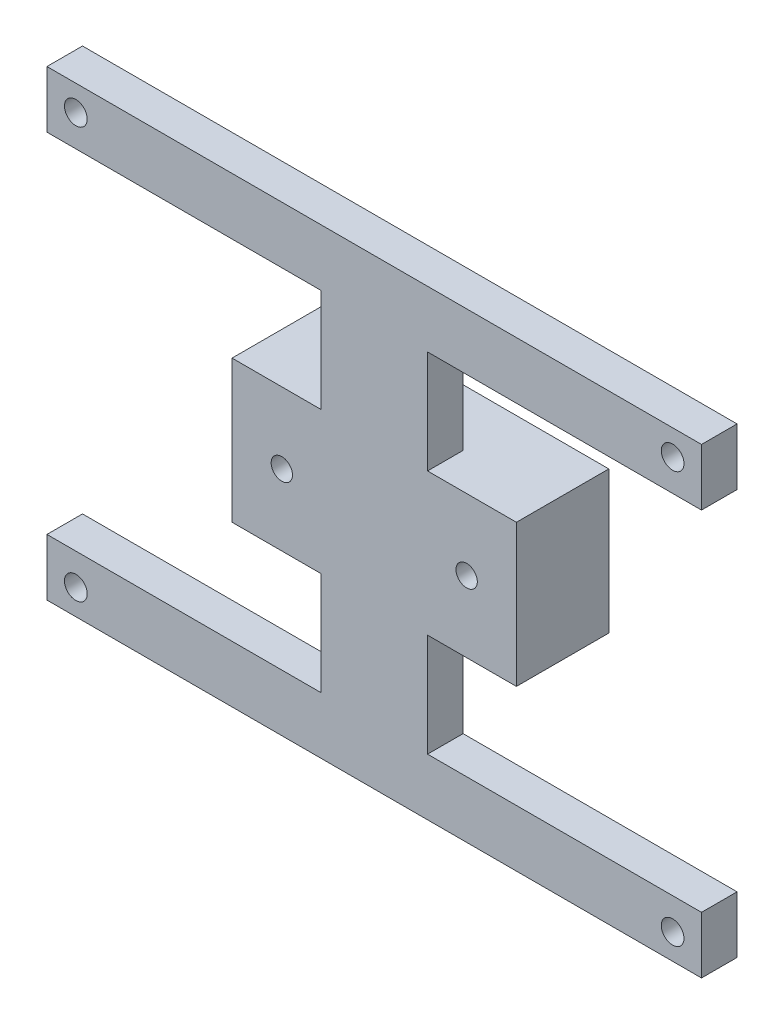
ISO-10303-21;
HEADER;
FILE_DESCRIPTION(('STEP AP214'),'2;1');
FILE_NAME('part.step','',(''),(''),'','','');
FILE_SCHEMA(('AUTOMOTIVE_DESIGN { 1 0 10303 214 1 1 1 1 }'));
ENDSEC;
DATA;
#1=APPLICATION_CONTEXT('core data for automotive mechanical design processes');
#2=APPLICATION_PROTOCOL_DEFINITION('international standard','automotive_design',2000,#1);
#3=PRODUCT_CONTEXT('',#1,'mechanical');
#4=PRODUCT('Part','Part','',(#3));
#5=PRODUCT_RELATED_PRODUCT_CATEGORY('part','',(#4));
#6=PRODUCT_DEFINITION_FORMATION('','',#4);
#7=PRODUCT_DEFINITION_CONTEXT('part definition',#1,'design');
#8=PRODUCT_DEFINITION('design','',#6,#7);
#9=PRODUCT_DEFINITION_SHAPE('','',#8);
#10=(LENGTH_UNIT() NAMED_UNIT(*) SI_UNIT(.MILLI.,.METRE.));
#11=(NAMED_UNIT(*) PLANE_ANGLE_UNIT() SI_UNIT($,.RADIAN.));
#12=(NAMED_UNIT(*) SI_UNIT($,.STERADIAN.) SOLID_ANGLE_UNIT());
#13=UNCERTAINTY_MEASURE_WITH_UNIT(LENGTH_MEASURE(1.E-05),#10,'distance_accuracy_value','');
#14=(GEOMETRIC_REPRESENTATION_CONTEXT(3) GLOBAL_UNCERTAINTY_ASSIGNED_CONTEXT((#13)) GLOBAL_UNIT_ASSIGNED_CONTEXT((#10,
#11,#12)) REPRESENTATION_CONTEXT('',''));
#15=CARTESIAN_POINT('',(0.,0.,0.));
#16=DIRECTION('',(0.,0.,1.));
#17=DIRECTION('',(1.,0.,0.));
#18=AXIS2_PLACEMENT_3D('',#15,#16,#17);
#19=CARTESIAN_POINT('',(0.,0.,0.));
#20=DIRECTION('',(0.,0.,1.));
#21=DIRECTION('',(1.,0.,0.));
#22=AXIS2_PLACEMENT_3D('',#19,#20,#21);
#23=PLANE('',#22);
#24=CARTESIAN_POINT('',(-41.9735,28.92,0.));
#25=DIRECTION('',(0.,0.,1.));
#26=DIRECTION('',(1.,0.,0.));
#27=AXIS2_PLACEMENT_3D('',#24,#25,#26);
#28=CIRCLE('',#27,1.6);
#29=CARTESIAN_POINT('',(-40.3735,28.92,0.));
#30=VERTEX_POINT('',#29);
#31=EDGE_CURVE('E206',#30,#30,#28,.T.);
#32=ORIENTED_EDGE('',*,*,#31,.T.);
#33=EDGE_LOOP('',(#32));
#34=FACE_BOUND('',#33,.T.);
#35=CARTESIAN_POINT('',(41.9735,28.92,0.));
#36=DIRECTION('',(0.,0.,1.));
#37=DIRECTION('',(1.,0.,0.));
#38=AXIS2_PLACEMENT_3D('',#35,#36,#37);
#39=CIRCLE('',#38,1.6);
#40=CARTESIAN_POINT('',(43.5735,28.92,0.));
#41=VERTEX_POINT('',#40);
#42=EDGE_CURVE('E203',#41,#41,#39,.T.);
#43=ORIENTED_EDGE('',*,*,#42,.T.);
#44=EDGE_LOOP('',(#43));
#45=FACE_BOUND('',#44,.T.);
#46=DIRECTION('',(1.,0.,0.));
#47=VECTOR('',#46,1.);
#48=CARTESIAN_POINT('',(20.,10.,0.));
#49=LINE('',#48,#47);
#50=CARTESIAN_POINT('',(-7.5,10.,0.));
#51=VERTEX_POINT('',#50);
#52=CARTESIAN_POINT('',(7.5,10.,0.));
#53=VERTEX_POINT('',#52);
#54=EDGE_CURVE('E11',#51,#53,#49,.T.);
#55=ORIENTED_EDGE('',*,*,#54,.F.);
#56=DIRECTION('',(0.,1.,0.));
#57=VECTOR('',#56,1.);
#58=CARTESIAN_POINT('',(-7.5,0.,0.));
#59=LINE('',#58,#57);
#60=CARTESIAN_POINT('',(-7.5,24.5,0.));
#61=VERTEX_POINT('',#60);
#62=EDGE_CURVE('E221',#51,#61,#59,.T.);
#63=ORIENTED_EDGE('',*,*,#62,.T.);
#64=DIRECTION('',(1.,0.,0.));
#65=VECTOR('',#64,1.);
#66=CARTESIAN_POINT('',(0.,24.5,0.));
#67=LINE('',#66,#65);
#68=CARTESIAN_POINT('',(-46.0375,24.5,0.));
#69=VERTEX_POINT('',#68);
#70=EDGE_CURVE('E218',#69,#61,#67,.T.);
#71=ORIENTED_EDGE('',*,*,#70,.F.);
#72=DIRECTION('',(0.,-1.,0.));
#73=VECTOR('',#72,1.);
#74=CARTESIAN_POINT('',(-46.0375,0.,0.));
#75=LINE('',#74,#73);
#76=CARTESIAN_POINT('',(-46.0375,32.5,0.));
#77=VERTEX_POINT('',#76);
#78=EDGE_CURVE('E215',#77,#69,#75,.T.);
#79=ORIENTED_EDGE('',*,*,#78,.F.);
#80=DIRECTION('',(1.,0.,0.));
#81=VECTOR('',#80,1.);
#82=CARTESIAN_POINT('',(0.,32.5,0.));
#83=LINE('',#82,#81);
#84=CARTESIAN_POINT('',(46.0375,32.5,0.));
#85=VERTEX_POINT('',#84);
#86=EDGE_CURVE('E212',#77,#85,#83,.T.);
#87=ORIENTED_EDGE('',*,*,#86,.T.);
#88=DIRECTION('',(0.,-1.,0.));
#89=VECTOR('',#88,1.);
#90=CARTESIAN_POINT('',(46.0375,0.,0.));
#91=LINE('',#90,#89);
#92=CARTESIAN_POINT('',(46.0375,24.5,0.));
#93=VERTEX_POINT('',#92);
#94=EDGE_CURVE('E210',#85,#93,#91,.T.);
#95=ORIENTED_EDGE('',*,*,#94,.T.);
#96=CARTESIAN_POINT('',(7.5,24.5,0.));
#97=VERTEX_POINT('',#96);
#98=EDGE_CURVE('E105',#97,#93,#67,.T.);
#99=ORIENTED_EDGE('',*,*,#98,.F.);
#100=DIRECTION('',(0.,1.,0.));
#101=VECTOR('',#100,1.);
#102=CARTESIAN_POINT('',(7.5,0.,0.));
#103=LINE('',#102,#101);
#104=EDGE_CURVE('E243',#53,#97,#103,.T.);
#105=ORIENTED_EDGE('',*,*,#104,.F.);
#106=EDGE_LOOP('',(#55,#63,#71,#79,#87,#95,#99,#105));
#107=FACE_BOUND('',#106,.T.);
#108=ADVANCED_FACE('F41',(#34,#45,#107),#23,.F.);
#109=CARTESIAN_POINT('',(41.9735,-28.92,0.));
#110=DIRECTION('',(0.,0.,1.));
#111=DIRECTION('',(1.,0.,0.));
#112=AXIS2_PLACEMENT_3D('',#109,#110,#111);
#113=CIRCLE('',#112,1.6);
#114=CARTESIAN_POINT('',(43.5735,-28.92,0.));
#115=VERTEX_POINT('',#114);
#116=EDGE_CURVE('E248',#115,#115,#113,.T.);
#117=ORIENTED_EDGE('',*,*,#116,.T.);
#118=EDGE_LOOP('',(#117));
#119=FACE_BOUND('',#118,.T.);
#120=CARTESIAN_POINT('',(-41.9735,-28.92,0.));
#121=DIRECTION('',(0.,0.,1.));
#122=DIRECTION('',(1.,0.,0.));
#123=AXIS2_PLACEMENT_3D('',#120,#121,#122);
#124=CIRCLE('',#123,1.6);
#125=CARTESIAN_POINT('',(-40.3735,-28.92,0.));
#126=VERTEX_POINT('',#125);
#127=EDGE_CURVE('E245',#126,#126,#124,.T.);
#128=ORIENTED_EDGE('',*,*,#127,.T.);
#129=EDGE_LOOP('',(#128));
#130=FACE_BOUND('',#129,.T.);
#131=DIRECTION('',(-1.,0.,0.));
#132=VECTOR('',#131,1.);
#133=CARTESIAN_POINT('',(20.,-10.,0.));
#134=LINE('',#133,#132);
#135=CARTESIAN_POINT('',(7.5,-10.,0.));
#136=VERTEX_POINT('',#135);
#137=CARTESIAN_POINT('',(-7.5,-10.,0.));
#138=VERTEX_POINT('',#137);
#139=EDGE_CURVE('E51',#136,#138,#134,.T.);
#140=ORIENTED_EDGE('',*,*,#139,.F.);
#141=DIRECTION('',(0.,1.,0.));
#142=VECTOR('',#141,1.);
#143=CARTESIAN_POINT('',(7.5,0.,0.));
#144=LINE('',#143,#142);
#145=CARTESIAN_POINT('',(7.5,-24.5,0.));
#146=VERTEX_POINT('',#145);
#147=EDGE_CURVE('E240',#146,#136,#144,.T.);
#148=ORIENTED_EDGE('',*,*,#147,.F.);
#149=DIRECTION('',(-1.,0.,0.));
#150=VECTOR('',#149,1.);
#151=CARTESIAN_POINT('',(0.,-24.5,0.));
#152=LINE('',#151,#150);
#153=CARTESIAN_POINT('',(46.0375,-24.5,0.));
#154=VERTEX_POINT('',#153);
#155=EDGE_CURVE('E231',#154,#146,#152,.T.);
#156=ORIENTED_EDGE('',*,*,#155,.F.);
#157=DIRECTION('',(0.,1.,0.));
#158=VECTOR('',#157,1.);
#159=CARTESIAN_POINT('',(46.0375,0.,0.));
#160=LINE('',#159,#158);
#161=CARTESIAN_POINT('',(46.0375,-32.5,0.));
#162=VERTEX_POINT('',#161);
#163=EDGE_CURVE('E237',#162,#154,#160,.T.);
#164=ORIENTED_EDGE('',*,*,#163,.F.);
#165=DIRECTION('',(-1.,0.,0.));
#166=VECTOR('',#165,1.);
#167=CARTESIAN_POINT('',(0.,-32.5,0.));
#168=LINE('',#167,#166);
#169=CARTESIAN_POINT('',(-46.0375,-32.5,0.));
#170=VERTEX_POINT('',#169);
#171=EDGE_CURVE('E234',#162,#170,#168,.T.);
#172=ORIENTED_EDGE('',*,*,#171,.T.);
#173=DIRECTION('',(0.,1.,0.));
#174=VECTOR('',#173,1.);
#175=CARTESIAN_POINT('',(-46.0375,0.,0.));
#176=LINE('',#175,#174);
#177=CARTESIAN_POINT('',(-46.0375,-24.5,0.));
#178=VERTEX_POINT('',#177);
#179=EDGE_CURVE('E230',#170,#178,#176,.T.);
#180=ORIENTED_EDGE('',*,*,#179,.T.);
#181=CARTESIAN_POINT('',(-7.5,-24.5,0.));
#182=VERTEX_POINT('',#181);
#183=EDGE_CURVE('E227',#182,#178,#152,.T.);
#184=ORIENTED_EDGE('',*,*,#183,.F.);
#185=DIRECTION('',(0.,1.,0.));
#186=VECTOR('',#185,1.);
#187=CARTESIAN_POINT('',(-7.5,0.,0.));
#188=LINE('',#187,#186);
#189=EDGE_CURVE('E224',#182,#138,#188,.T.);
#190=ORIENTED_EDGE('',*,*,#189,.T.);
#191=EDGE_LOOP('',(#140,#148,#156,#164,#172,#180,#184,#190));
#192=FACE_BOUND('',#191,.T.);
#193=ADVANCED_FACE('F375',(#119,#130,#192),#23,.F.);
#194=CARTESIAN_POINT('',(46.0375,0.,5.));
#195=DIRECTION('',(1.,0.,0.));
#196=DIRECTION('',(0.,0.,-1.));
#197=AXIS2_PLACEMENT_3D('',#194,#195,#196);
#198=PLANE('',#197);
#199=ORIENTED_EDGE('',*,*,#94,.F.);
#200=DIRECTION('',(0.,0.,-1.));
#201=VECTOR('',#200,1.);
#202=CARTESIAN_POINT('',(46.0375,32.5,5.));
#203=LINE('',#202,#201);
#204=CARTESIAN_POINT('',(46.0375,32.5,5.));
#205=VERTEX_POINT('',#204);
#206=EDGE_CURVE('E45',#205,#85,#203,.T.);
#207=ORIENTED_EDGE('',*,*,#206,.F.);
#208=DIRECTION('',(0.,-1.,0.));
#209=VECTOR('',#208,1.);
#210=CARTESIAN_POINT('',(46.0375,0.,5.));
#211=LINE('',#210,#209);
#212=CARTESIAN_POINT('',(46.0375,24.5,5.));
#213=VERTEX_POINT('',#212);
#214=EDGE_CURVE('E315',#205,#213,#211,.T.);
#215=ORIENTED_EDGE('',*,*,#214,.T.);
#216=DIRECTION('',(0.,0.,-1.));
#217=VECTOR('',#216,1.);
#218=CARTESIAN_POINT('',(46.0375,24.5,5.));
#219=LINE('',#218,#217);
#220=EDGE_CURVE('E112',#213,#93,#219,.T.);
#221=ORIENTED_EDGE('',*,*,#220,.T.);
#222=EDGE_LOOP('',(#199,#207,#215,#221));
#223=FACE_BOUND('',#222,.T.);
#224=ADVANCED_FACE('F444',(#223),#198,.T.);
#225=CARTESIAN_POINT('',(0.,32.5,5.));
#226=DIRECTION('',(0.,1.,0.));
#227=DIRECTION('',(0.,0.,1.));
#228=AXIS2_PLACEMENT_3D('',#225,#226,#227);
#229=PLANE('',#228);
#230=ORIENTED_EDGE('',*,*,#86,.F.);
#231=DIRECTION('',(0.,0.,-1.));
#232=VECTOR('',#231,1.);
#233=CARTESIAN_POINT('',(-46.0375,32.5,5.));
#234=LINE('',#233,#232);
#235=CARTESIAN_POINT('',(-46.0375,32.5,5.));
#236=VERTEX_POINT('',#235);
#237=EDGE_CURVE('E290',#236,#77,#234,.T.);
#238=ORIENTED_EDGE('',*,*,#237,.F.);
#239=DIRECTION('',(1.,0.,0.));
#240=VECTOR('',#239,1.);
#241=CARTESIAN_POINT('',(0.,32.5,5.));
#242=LINE('',#241,#240);
#243=EDGE_CURVE('E317',#236,#205,#242,.T.);
#244=ORIENTED_EDGE('',*,*,#243,.T.);
#245=ORIENTED_EDGE('',*,*,#206,.T.);
#246=EDGE_LOOP('',(#230,#238,#244,#245));
#247=FACE_BOUND('',#246,.T.);
#248=ADVANCED_FACE('F495',(#247),#229,.T.);
#249=CARTESIAN_POINT('',(-46.0375,0.,5.));
#250=DIRECTION('',(1.,0.,0.));
#251=DIRECTION('',(0.,1.,0.));
#252=AXIS2_PLACEMENT_3D('',#249,#250,#251);
#253=PLANE('',#252);
#254=ORIENTED_EDGE('',*,*,#78,.T.);
#255=DIRECTION('',(0.,0.,-1.));
#256=VECTOR('',#255,1.);
#257=CARTESIAN_POINT('',(-46.0375,24.5,5.));
#258=LINE('',#257,#256);
#259=CARTESIAN_POINT('',(-46.0375,24.5,5.));
#260=VERTEX_POINT('',#259);
#261=EDGE_CURVE('E288',#260,#69,#258,.T.);
#262=ORIENTED_EDGE('',*,*,#261,.F.);
#263=DIRECTION('',(0.,-1.,0.));
#264=VECTOR('',#263,1.);
#265=CARTESIAN_POINT('',(-46.0375,0.,5.));
#266=LINE('',#265,#264);
#267=EDGE_CURVE('E319',#236,#260,#266,.T.);
#268=ORIENTED_EDGE('',*,*,#267,.F.);
#269=ORIENTED_EDGE('',*,*,#237,.T.);
#270=EDGE_LOOP('',(#254,#262,#268,#269));
#271=FACE_BOUND('',#270,.T.);
#272=ADVANCED_FACE('F492',(#271),#253,.F.);
#273=CARTESIAN_POINT('',(0.,24.5,5.));
#274=DIRECTION('',(0.,1.,0.));
#275=DIRECTION('',(0.,0.,1.));
#276=AXIS2_PLACEMENT_3D('',#273,#274,#275);
#277=PLANE('',#276);
#278=ORIENTED_EDGE('',*,*,#70,.T.);
#279=DIRECTION('',(0.,0.,-1.));
#280=VECTOR('',#279,1.);
#281=CARTESIAN_POINT('',(-7.5,24.5,5.));
#282=LINE('',#281,#280);
#283=CARTESIAN_POINT('',(-7.5,24.5,5.));
#284=VERTEX_POINT('',#283);
#285=EDGE_CURVE('E286',#284,#61,#282,.T.);
#286=ORIENTED_EDGE('',*,*,#285,.F.);
#287=DIRECTION('',(1.,0.,0.));
#288=VECTOR('',#287,1.);
#289=CARTESIAN_POINT('',(0.,24.5,5.));
#290=LINE('',#289,#288);
#291=EDGE_CURVE('E322',#260,#284,#290,.T.);
#292=ORIENTED_EDGE('',*,*,#291,.F.);
#293=ORIENTED_EDGE('',*,*,#261,.T.);
#294=EDGE_LOOP('',(#278,#286,#292,#293));
#295=FACE_BOUND('',#294,.T.);
#296=ADVANCED_FACE('F463',(#295),#277,.F.);
#297=CARTESIAN_POINT('',(-7.5,0.,5.));
#298=DIRECTION('',(-1.,0.,0.));
#299=DIRECTION('',(0.,0.,1.));
#300=AXIS2_PLACEMENT_3D('',#297,#298,#299);
#301=PLANE('',#300);
#302=ORIENTED_EDGE('',*,*,#62,.F.);
#303=DIRECTION('',(0.,0.,-1.));
#304=VECTOR('',#303,1.);
#305=CARTESIAN_POINT('',(-7.5,10.,5.));
#306=LINE('',#305,#304);
#307=CARTESIAN_POINT('',(-7.5,10.,5.));
#308=VERTEX_POINT('',#307);
#309=EDGE_CURVE('E284',#308,#51,#306,.T.);
#310=ORIENTED_EDGE('',*,*,#309,.F.);
#311=DIRECTION('',(0.,1.,0.));
#312=VECTOR('',#311,1.);
#313=CARTESIAN_POINT('',(-7.5,0.,5.));
#314=LINE('',#313,#312);
#315=EDGE_CURVE('E324',#308,#284,#314,.T.);
#316=ORIENTED_EDGE('',*,*,#315,.T.);
#317=ORIENTED_EDGE('',*,*,#285,.T.);
#318=EDGE_LOOP('',(#302,#310,#316,#317));
#319=FACE_BOUND('',#318,.T.);
#320=ADVANCED_FACE('F488',(#319),#301,.T.);
#321=CARTESIAN_POINT('',(-20.,0.,5.));
#322=DIRECTION('',(-1.,0.,0.));
#323=DIRECTION('',(0.,0.,1.));
#324=AXIS2_PLACEMENT_3D('',#321,#322,#323);
#325=PLANE('',#324);
#326=DIRECTION('',(0.,0.,-1.));
#327=VECTOR('',#326,1.);
#328=CARTESIAN_POINT('',(-20.,10.,5.));
#329=LINE('',#328,#327);
#330=CARTESIAN_POINT('',(-20.,10.,5.));
#331=VERTEX_POINT('',#330);
#332=CARTESIAN_POINT('',(-20.,10.,-8.));
#333=VERTEX_POINT('',#332);
#334=EDGE_CURVE('E281',#331,#333,#329,.T.);
#335=ORIENTED_EDGE('',*,*,#334,.T.);
#336=DIRECTION('',(0.,1.,0.));
#337=VECTOR('',#336,1.);
#338=CARTESIAN_POINT('',(-20.,10.,-8.));
#339=LINE('',#338,#337);
#340=CARTESIAN_POINT('',(-20.,-10.,-8.));
#341=VERTEX_POINT('',#340);
#342=EDGE_CURVE('E410',#341,#333,#339,.T.);
#343=ORIENTED_EDGE('',*,*,#342,.F.);
#344=DIRECTION('',(0.,0.,-1.));
#345=VECTOR('',#344,1.);
#346=CARTESIAN_POINT('',(-20.,-10.,5.));
#347=LINE('',#346,#345);
#348=CARTESIAN_POINT('',(-20.,-10.,5.));
#349=VERTEX_POINT('',#348);
#350=EDGE_CURVE('E278',#349,#341,#347,.T.);
#351=ORIENTED_EDGE('',*,*,#350,.F.);
#352=DIRECTION('',(0.,1.,0.));
#353=VECTOR('',#352,1.);
#354=CARTESIAN_POINT('',(-20.,0.,5.));
#355=LINE('',#354,#353);
#356=EDGE_CURVE('E330',#349,#331,#355,.T.);
#357=ORIENTED_EDGE('',*,*,#356,.T.);
#358=EDGE_LOOP('',(#335,#343,#351,#357));
#359=FACE_BOUND('',#358,.T.);
#360=ADVANCED_FACE('F407',(#359),#325,.T.);
#361=CARTESIAN_POINT('',(-7.5,0.,5.));
#362=DIRECTION('',(-1.,0.,0.));
#363=DIRECTION('',(0.,0.,1.));
#364=AXIS2_PLACEMENT_3D('',#361,#362,#363);
#365=PLANE('',#364);
#366=ORIENTED_EDGE('',*,*,#189,.F.);
#367=DIRECTION('',(0.,0.,-1.));
#368=VECTOR('',#367,1.);
#369=CARTESIAN_POINT('',(-7.5,-24.5,5.));
#370=LINE('',#369,#368);
#371=CARTESIAN_POINT('',(-7.5,-24.5,5.));
#372=VERTEX_POINT('',#371);
#373=EDGE_CURVE('E273',#372,#182,#370,.T.);
#374=ORIENTED_EDGE('',*,*,#373,.F.);
#375=DIRECTION('',(0.,1.,0.));
#376=VECTOR('',#375,1.);
#377=CARTESIAN_POINT('',(-7.5,0.,5.));
#378=LINE('',#377,#376);
#379=CARTESIAN_POINT('',(-7.5,-10.,5.));
#380=VERTEX_POINT('',#379);
#381=EDGE_CURVE('E335',#372,#380,#378,.T.);
#382=ORIENTED_EDGE('',*,*,#381,.T.);
#383=DIRECTION('',(0.,0.,-1.));
#384=VECTOR('',#383,1.);
#385=CARTESIAN_POINT('',(-7.5,-10.,5.));
#386=LINE('',#385,#384);
#387=EDGE_CURVE('E275',#380,#138,#386,.T.);
#388=ORIENTED_EDGE('',*,*,#387,.T.);
#389=EDGE_LOOP('',(#366,#374,#382,#388));
#390=FACE_BOUND('',#389,.T.);
#391=ADVANCED_FACE('F399',(#390),#365,.T.);
#392=CARTESIAN_POINT('',(0.,-24.5,5.));
#393=DIRECTION('',(0.,-1.,0.));
#394=DIRECTION('',(1.,0.,0.));
#395=AXIS2_PLACEMENT_3D('',#392,#393,#394);
#396=PLANE('',#395);
#397=ORIENTED_EDGE('',*,*,#183,.T.);
#398=DIRECTION('',(0.,0.,-1.));
#399=VECTOR('',#398,1.);
#400=CARTESIAN_POINT('',(-46.0375,-24.5,5.));
#401=LINE('',#400,#399);
#402=CARTESIAN_POINT('',(-46.0375,-24.5,5.));
#403=VERTEX_POINT('',#402);
#404=EDGE_CURVE('E271',#403,#178,#401,.T.);
#405=ORIENTED_EDGE('',*,*,#404,.F.);
#406=DIRECTION('',(-1.,0.,0.));
#407=VECTOR('',#406,1.);
#408=CARTESIAN_POINT('',(0.,-24.5,5.));
#409=LINE('',#408,#407);
#410=EDGE_CURVE('E338',#372,#403,#409,.T.);
#411=ORIENTED_EDGE('',*,*,#410,.F.);
#412=ORIENTED_EDGE('',*,*,#373,.T.);
#413=EDGE_LOOP('',(#397,#405,#411,#412));
#414=FACE_BOUND('',#413,.T.);
#415=ADVANCED_FACE('F477',(#414),#396,.F.);
#416=CARTESIAN_POINT('',(-46.0375,0.,5.));
#417=DIRECTION('',(-1.,0.,0.));
#418=DIRECTION('',(0.,-1.,0.));
#419=AXIS2_PLACEMENT_3D('',#416,#417,#418);
#420=PLANE('',#419);
#421=ORIENTED_EDGE('',*,*,#179,.F.);
#422=DIRECTION('',(0.,0.,-1.));
#423=VECTOR('',#422,1.);
#424=CARTESIAN_POINT('',(-46.0375,-32.5,5.));
#425=LINE('',#424,#423);
#426=CARTESIAN_POINT('',(-46.0375,-32.5,5.));
#427=VERTEX_POINT('',#426);
#428=EDGE_CURVE('E269',#427,#170,#425,.T.);
#429=ORIENTED_EDGE('',*,*,#428,.F.);
#430=DIRECTION('',(0.,1.,0.));
#431=VECTOR('',#430,1.);
#432=CARTESIAN_POINT('',(-46.0375,0.,5.));
#433=LINE('',#432,#431);
#434=EDGE_CURVE('E340',#427,#403,#433,.T.);
#435=ORIENTED_EDGE('',*,*,#434,.T.);
#436=ORIENTED_EDGE('',*,*,#404,.T.);
#437=EDGE_LOOP('',(#421,#429,#435,#436));
#438=FACE_BOUND('',#437,.T.);
#439=ADVANCED_FACE('F395',(#438),#420,.T.);
#440=CARTESIAN_POINT('',(0.,-32.5,5.));
#441=DIRECTION('',(0.,-1.,0.));
#442=DIRECTION('',(0.,0.,-1.));
#443=AXIS2_PLACEMENT_3D('',#440,#441,#442);
#444=PLANE('',#443);
#445=ORIENTED_EDGE('',*,*,#171,.F.);
#446=DIRECTION('',(0.,0.,-1.));
#447=VECTOR('',#446,1.);
#448=CARTESIAN_POINT('',(46.0375,-32.5,5.));
#449=LINE('',#448,#447);
#450=CARTESIAN_POINT('',(46.0375,-32.5,5.));
#451=VERTEX_POINT('',#450);
#452=EDGE_CURVE('E267',#451,#162,#449,.T.);
#453=ORIENTED_EDGE('',*,*,#452,.F.);
#454=DIRECTION('',(-1.,0.,0.));
#455=VECTOR('',#454,1.);
#456=CARTESIAN_POINT('',(0.,-32.5,5.));
#457=LINE('',#456,#455);
#458=EDGE_CURVE('E344',#451,#427,#457,.T.);
#459=ORIENTED_EDGE('',*,*,#458,.T.);
#460=ORIENTED_EDGE('',*,*,#428,.T.);
#461=EDGE_LOOP('',(#445,#453,#459,#460));
#462=FACE_BOUND('',#461,.T.);
#463=ADVANCED_FACE('F389',(#462),#444,.T.);
#464=CARTESIAN_POINT('',(46.0375,0.,5.));
#465=DIRECTION('',(-1.,0.,0.));
#466=DIRECTION('',(0.,0.,1.));
#467=AXIS2_PLACEMENT_3D('',#464,#465,#466);
#468=PLANE('',#467);
#469=ORIENTED_EDGE('',*,*,#163,.T.);
#470=DIRECTION('',(0.,0.,-1.));
#471=VECTOR('',#470,1.);
#472=CARTESIAN_POINT('',(46.0375,-24.5,5.));
#473=LINE('',#472,#471);
#474=CARTESIAN_POINT('',(46.0375,-24.5,5.));
#475=VERTEX_POINT('',#474);
#476=EDGE_CURVE('E264',#475,#154,#473,.T.);
#477=ORIENTED_EDGE('',*,*,#476,.F.);
#478=DIRECTION('',(0.,1.,0.));
#479=VECTOR('',#478,1.);
#480=CARTESIAN_POINT('',(46.0375,0.,5.));
#481=LINE('',#480,#479);
#482=EDGE_CURVE('E347',#451,#475,#481,.T.);
#483=ORIENTED_EDGE('',*,*,#482,.F.);
#484=ORIENTED_EDGE('',*,*,#452,.T.);
#485=EDGE_LOOP('',(#469,#477,#483,#484));
#486=FACE_BOUND('',#485,.T.);
#487=ADVANCED_FACE('F476',(#486),#468,.F.);
#488=ORIENTED_EDGE('',*,*,#155,.T.);
#489=DIRECTION('',(0.,0.,-1.));
#490=VECTOR('',#489,1.);
#491=CARTESIAN_POINT('',(7.5,-24.5,5.));
#492=LINE('',#491,#490);
#493=CARTESIAN_POINT('',(7.5,-24.5,5.));
#494=VERTEX_POINT('',#493);
#495=EDGE_CURVE('E261',#494,#146,#492,.T.);
#496=ORIENTED_EDGE('',*,*,#495,.F.);
#497=EDGE_CURVE('E341',#475,#494,#409,.T.);
#498=ORIENTED_EDGE('',*,*,#497,.F.);
#499=ORIENTED_EDGE('',*,*,#476,.T.);
#500=EDGE_LOOP('',(#488,#496,#498,#499));
#501=FACE_BOUND('',#500,.T.);
#502=ADVANCED_FACE('F383',(#501),#396,.F.);
#503=CARTESIAN_POINT('',(7.5,0.,5.));
#504=DIRECTION('',(-1.,0.,0.));
#505=DIRECTION('',(0.,0.,1.));
#506=AXIS2_PLACEMENT_3D('',#503,#504,#505);
#507=PLANE('',#506);
#508=ORIENTED_EDGE('',*,*,#147,.T.);
#509=DIRECTION('',(0.,0.,-1.));
#510=VECTOR('',#509,1.);
#511=CARTESIAN_POINT('',(7.5,-10.,5.));
#512=LINE('',#511,#510);
#513=CARTESIAN_POINT('',(7.5,-10.,5.));
#514=VERTEX_POINT('',#513);
#515=EDGE_CURVE('E258',#514,#136,#512,.T.);
#516=ORIENTED_EDGE('',*,*,#515,.F.);
#517=DIRECTION('',(0.,1.,0.));
#518=VECTOR('',#517,1.);
#519=CARTESIAN_POINT('',(7.5,0.,5.));
#520=LINE('',#519,#518);
#521=EDGE_CURVE('E350',#494,#514,#520,.T.);
#522=ORIENTED_EDGE('',*,*,#521,.F.);
#523=ORIENTED_EDGE('',*,*,#495,.T.);
#524=EDGE_LOOP('',(#508,#516,#522,#523));
#525=FACE_BOUND('',#524,.T.);
#526=ADVANCED_FACE('F379',(#525),#507,.F.);
#527=CARTESIAN_POINT('',(0.,-10.,5.));
#528=DIRECTION('',(0.,1.,0.));
#529=DIRECTION('',(0.,0.,1.));
#530=AXIS2_PLACEMENT_3D('',#527,#528,#529);
#531=PLANE('',#530);
#532=ORIENTED_EDGE('',*,*,#515,.T.);
#533=ORIENTED_EDGE('',*,*,#139,.T.);
#534=ORIENTED_EDGE('',*,*,#387,.F.);
#535=DIRECTION('',(1.,0.,0.));
#536=VECTOR('',#535,1.);
#537=CARTESIAN_POINT('',(0.,-10.,5.));
#538=LINE('',#537,#536);
#539=EDGE_CURVE('E333',#349,#380,#538,.T.);
#540=ORIENTED_EDGE('',*,*,#539,.F.);
#541=ORIENTED_EDGE('',*,*,#350,.T.);
#542=DIRECTION('',(-1.,0.,0.));
#543=VECTOR('',#542,1.);
#544=CARTESIAN_POINT('',(20.,-10.,-8.));
#545=LINE('',#544,#543);
#546=CARTESIAN_POINT('',(20.,-10.,-8.));
#547=VERTEX_POINT('',#546);
#548=EDGE_CURVE('E359',#547,#341,#545,.T.);
#549=ORIENTED_EDGE('',*,*,#548,.F.);
#550=DIRECTION('',(0.,0.,-1.));
#551=VECTOR('',#550,1.);
#552=CARTESIAN_POINT('',(20.,-10.,5.));
#553=LINE('',#552,#551);
#554=CARTESIAN_POINT('',(20.,-10.,5.));
#555=VERTEX_POINT('',#554);
#556=EDGE_CURVE('E255',#555,#547,#553,.T.);
#557=ORIENTED_EDGE('',*,*,#556,.F.);
#558=DIRECTION('',(1.,0.,0.));
#559=VECTOR('',#558,1.);
#560=CARTESIAN_POINT('',(0.,-10.,5.));
#561=LINE('',#560,#559);
#562=EDGE_CURVE('E193',#514,#555,#561,.T.);
#563=ORIENTED_EDGE('',*,*,#562,.F.);
#564=EDGE_LOOP('',(#532,#533,#534,#540,#541,#549,#557,#563));
#565=FACE_BOUND('',#564,.T.);
#566=ADVANCED_FACE('F356',(#565),#531,.F.);
#567=CARTESIAN_POINT('',(20.,0.,5.));
#568=DIRECTION('',(-1.,0.,0.));
#569=DIRECTION('',(0.,0.,1.));
#570=AXIS2_PLACEMENT_3D('',#567,#568,#569);
#571=PLANE('',#570);
#572=ORIENTED_EDGE('',*,*,#556,.T.);
#573=DIRECTION('',(0.,-1.,0.));
#574=VECTOR('',#573,1.);
#575=CARTESIAN_POINT('',(20.,10.,-8.));
#576=LINE('',#575,#574);
#577=CARTESIAN_POINT('',(20.,10.,-8.));
#578=VERTEX_POINT('',#577);
#579=EDGE_CURVE('E365',#578,#547,#576,.T.);
#580=ORIENTED_EDGE('',*,*,#579,.F.);
#581=DIRECTION('',(0.,0.,-1.));
#582=VECTOR('',#581,1.);
#583=CARTESIAN_POINT('',(20.,10.,5.));
#584=LINE('',#583,#582);
#585=CARTESIAN_POINT('',(20.,10.,5.));
#586=VERTEX_POINT('',#585);
#587=EDGE_CURVE('E180',#586,#578,#584,.T.);
#588=ORIENTED_EDGE('',*,*,#587,.F.);
#589=DIRECTION('',(0.,1.,0.));
#590=VECTOR('',#589,1.);
#591=CARTESIAN_POINT('',(20.,0.,5.));
#592=LINE('',#591,#590);
#593=EDGE_CURVE('E190',#555,#586,#592,.T.);
#594=ORIENTED_EDGE('',*,*,#593,.F.);
#595=EDGE_LOOP('',(#572,#580,#588,#594));
#596=FACE_BOUND('',#595,.T.);
#597=ADVANCED_FACE('F363',(#596),#571,.F.);
#598=CARTESIAN_POINT('',(0.,10.,5.));
#599=DIRECTION('',(0.,1.,0.));
#600=DIRECTION('',(0.,0.,1.));
#601=AXIS2_PLACEMENT_3D('',#598,#599,#600);
#602=PLANE('',#601);
#603=ORIENTED_EDGE('',*,*,#587,.T.);
#604=DIRECTION('',(1.,0.,0.));
#605=VECTOR('',#604,1.);
#606=CARTESIAN_POINT('',(20.,10.,-8.));
#607=LINE('',#606,#605);
#608=EDGE_CURVE('E302',#333,#578,#607,.T.);
#609=ORIENTED_EDGE('',*,*,#608,.F.);
#610=ORIENTED_EDGE('',*,*,#334,.F.);
#611=DIRECTION('',(1.,0.,0.));
#612=VECTOR('',#611,1.);
#613=CARTESIAN_POINT('',(0.,10.,5.));
#614=LINE('',#613,#612);
#615=EDGE_CURVE('E327',#331,#308,#614,.T.);
#616=ORIENTED_EDGE('',*,*,#615,.T.);
#617=ORIENTED_EDGE('',*,*,#309,.T.);
#618=ORIENTED_EDGE('',*,*,#54,.T.);
#619=DIRECTION('',(0.,0.,-1.));
#620=VECTOR('',#619,1.);
#621=CARTESIAN_POINT('',(7.5,10.,5.));
#622=LINE('',#621,#620);
#623=CARTESIAN_POINT('',(7.5,10.,5.));
#624=VERTEX_POINT('',#623);
#625=EDGE_CURVE('E169',#624,#53,#622,.T.);
#626=ORIENTED_EDGE('',*,*,#625,.F.);
#627=DIRECTION('',(1.,0.,0.));
#628=VECTOR('',#627,1.);
#629=CARTESIAN_POINT('',(0.,10.,5.));
#630=LINE('',#629,#628);
#631=EDGE_CURVE('E174',#624,#586,#630,.T.);
#632=ORIENTED_EDGE('',*,*,#631,.T.);
#633=EDGE_LOOP('',(#603,#609,#610,#616,#617,#618,#626,#632));
#634=FACE_BOUND('',#633,.T.);
#635=ADVANCED_FACE('F172',(#634),#602,.T.);
#636=CARTESIAN_POINT('',(7.5,0.,5.));
#637=DIRECTION('',(-1.,0.,0.));
#638=DIRECTION('',(0.,0.,1.));
#639=AXIS2_PLACEMENT_3D('',#636,#637,#638);
#640=PLANE('',#639);
#641=ORIENTED_EDGE('',*,*,#104,.T.);
#642=DIRECTION('',(0.,0.,-1.));
#643=VECTOR('',#642,1.);
#644=CARTESIAN_POINT('',(7.5,24.5,5.));
#645=LINE('',#644,#643);
#646=CARTESIAN_POINT('',(7.5,24.5,5.));
#647=VERTEX_POINT('',#646);
#648=EDGE_CURVE('E181',#647,#97,#645,.T.);
#649=ORIENTED_EDGE('',*,*,#648,.F.);
#650=DIRECTION('',(0.,1.,0.));
#651=VECTOR('',#650,1.);
#652=CARTESIAN_POINT('',(7.5,0.,5.));
#653=LINE('',#652,#651);
#654=EDGE_CURVE('E184',#624,#647,#653,.T.);
#655=ORIENTED_EDGE('',*,*,#654,.F.);
#656=ORIENTED_EDGE('',*,*,#625,.T.);
#657=EDGE_LOOP('',(#641,#649,#655,#656));
#658=FACE_BOUND('',#657,.T.);
#659=ADVANCED_FACE('F185',(#658),#640,.F.);
#660=CARTESIAN_POINT('',(-41.9735,-28.92,5.));
#661=DIRECTION('',(0.,0.,-1.));
#662=DIRECTION('',(-1.,0.,0.));
#663=AXIS2_PLACEMENT_3D('',#660,#661,#662);
#664=CYLINDRICAL_SURFACE('',#663,1.6);
#665=CARTESIAN_POINT('',(-41.9735,-28.92,5.));
#666=DIRECTION('',(0.,0.,1.));
#667=DIRECTION('',(1.,0.,0.));
#668=AXIS2_PLACEMENT_3D('',#665,#666,#667);
#669=CIRCLE('',#668,1.6);
#670=CARTESIAN_POINT('',(-40.3735,-28.92,5.));
#671=VERTEX_POINT('',#670);
#672=EDGE_CURVE('E197',#671,#671,#669,.T.);
#673=ORIENTED_EDGE('',*,*,#672,.T.);
#674=EDGE_LOOP('',(#673));
#675=FACE_BOUND('',#674,.T.);
#676=ORIENTED_EDGE('',*,*,#127,.F.);
#677=EDGE_LOOP('',(#676));
#678=FACE_BOUND('',#677,.T.);
#679=ADVANCED_FACE('F454',(#675,#678),#664,.F.);
#680=ORIENTED_EDGE('',*,*,#98,.T.);
#681=ORIENTED_EDGE('',*,*,#220,.F.);
#682=EDGE_CURVE('E60',#647,#213,#290,.T.);
#683=ORIENTED_EDGE('',*,*,#682,.F.);
#684=ORIENTED_EDGE('',*,*,#648,.T.);
#685=EDGE_LOOP('',(#680,#681,#683,#684));
#686=FACE_BOUND('',#685,.T.);
#687=ADVANCED_FACE('F457',(#686),#277,.F.);
#688=CARTESIAN_POINT('',(-41.9735,28.92,5.));
#689=DIRECTION('',(0.,0.,-1.));
#690=DIRECTION('',(-1.,0.,0.));
#691=AXIS2_PLACEMENT_3D('',#688,#689,#690);
#692=CYLINDRICAL_SURFACE('',#691,1.6);
#693=CARTESIAN_POINT('',(-41.9735,28.92,5.));
#694=DIRECTION('',(0.,0.,1.));
#695=DIRECTION('',(1.,0.,0.));
#696=AXIS2_PLACEMENT_3D('',#693,#694,#695);
#697=CIRCLE('',#696,1.6);
#698=CARTESIAN_POINT('',(-40.3735,28.92,5.));
#699=VERTEX_POINT('',#698);
#700=EDGE_CURVE('E312',#699,#699,#697,.T.);
#701=ORIENTED_EDGE('',*,*,#700,.T.);
#702=EDGE_LOOP('',(#701));
#703=FACE_BOUND('',#702,.T.);
#704=ORIENTED_EDGE('',*,*,#31,.F.);
#705=EDGE_LOOP('',(#704));
#706=FACE_BOUND('',#705,.T.);
#707=ADVANCED_FACE('F461',(#703,#706),#692,.F.);
#708=CARTESIAN_POINT('',(41.9735,28.92,5.));
#709=DIRECTION('',(0.,0.,-1.));
#710=DIRECTION('',(-1.,0.,0.));
#711=AXIS2_PLACEMENT_3D('',#708,#709,#710);
#712=CYLINDRICAL_SURFACE('',#711,1.6);
#713=CARTESIAN_POINT('',(41.9735,28.92,5.));
#714=DIRECTION('',(0.,0.,1.));
#715=DIRECTION('',(1.,0.,0.));
#716=AXIS2_PLACEMENT_3D('',#713,#714,#715);
#717=CIRCLE('',#716,1.6);
#718=CARTESIAN_POINT('',(43.5735,28.92,5.));
#719=VERTEX_POINT('',#718);
#720=EDGE_CURVE('E251',#719,#719,#717,.T.);
#721=ORIENTED_EDGE('',*,*,#720,.T.);
#722=EDGE_LOOP('',(#721));
#723=FACE_BOUND('',#722,.T.);
#724=ORIENTED_EDGE('',*,*,#42,.F.);
#725=EDGE_LOOP('',(#724));
#726=FACE_BOUND('',#725,.T.);
#727=ADVANCED_FACE('F43',(#723,#726),#712,.F.);
#728=CARTESIAN_POINT('',(41.9735,-28.92,5.));
#729=DIRECTION('',(0.,0.,-1.));
#730=DIRECTION('',(-1.,0.,0.));
#731=AXIS2_PLACEMENT_3D('',#728,#729,#730);
#732=CYLINDRICAL_SURFACE('',#731,1.6);
#733=CARTESIAN_POINT('',(41.9735,-28.92,5.));
#734=DIRECTION('',(0.,0.,1.));
#735=DIRECTION('',(1.,0.,0.));
#736=AXIS2_PLACEMENT_3D('',#733,#734,#735);
#737=CIRCLE('',#736,1.6);
#738=CARTESIAN_POINT('',(43.5735,-28.92,5.));
#739=VERTEX_POINT('',#738);
#740=EDGE_CURVE('E200',#739,#739,#737,.T.);
#741=ORIENTED_EDGE('',*,*,#740,.T.);
#742=EDGE_LOOP('',(#741));
#743=FACE_BOUND('',#742,.T.);
#744=ORIENTED_EDGE('',*,*,#116,.F.);
#745=EDGE_LOOP('',(#744));
#746=FACE_BOUND('',#745,.T.);
#747=ADVANCED_FACE('F450',(#743,#746),#732,.F.);
#748=CARTESIAN_POINT('',(0.,0.,5.));
#749=DIRECTION('',(0.,0.,1.));
#750=DIRECTION('',(1.,0.,0.));
#751=AXIS2_PLACEMENT_3D('',#748,#749,#750);
#752=PLANE('',#751);
#753=CARTESIAN_POINT('',(13.,0.,5.));
#754=DIRECTION('',(0.,0.,1.));
#755=DIRECTION('',(1.,0.,0.));
#756=AXIS2_PLACEMENT_3D('',#753,#754,#755);
#757=CIRCLE('',#756,1.5);
#758=CARTESIAN_POINT('',(14.5,0.,5.));
#759=VERTEX_POINT('',#758);
#760=EDGE_CURVE('E207',#759,#759,#757,.T.);
#761=ORIENTED_EDGE('',*,*,#760,.F.);
#762=EDGE_LOOP('',(#761));
#763=FACE_BOUND('',#762,.T.);
#764=CARTESIAN_POINT('',(-13.,0.,5.));
#765=DIRECTION('',(0.,0.,1.));
#766=DIRECTION('',(1.,0.,0.));
#767=AXIS2_PLACEMENT_3D('',#764,#765,#766);
#768=CIRCLE('',#767,1.5);
#769=CARTESIAN_POINT('',(-11.5,0.,5.));
#770=VERTEX_POINT('',#769);
#771=EDGE_CURVE('E307',#770,#770,#768,.T.);
#772=ORIENTED_EDGE('',*,*,#771,.F.);
#773=EDGE_LOOP('',(#772));
#774=FACE_BOUND('',#773,.T.);
#775=ORIENTED_EDGE('',*,*,#720,.F.);
#776=EDGE_LOOP('',(#775));
#777=FACE_BOUND('',#776,.T.);
#778=ORIENTED_EDGE('',*,*,#700,.F.);
#779=EDGE_LOOP('',(#778));
#780=FACE_BOUND('',#779,.T.);
#781=ORIENTED_EDGE('',*,*,#214,.F.);
#782=ORIENTED_EDGE('',*,*,#243,.F.);
#783=ORIENTED_EDGE('',*,*,#267,.T.);
#784=ORIENTED_EDGE('',*,*,#291,.T.);
#785=ORIENTED_EDGE('',*,*,#315,.F.);
#786=ORIENTED_EDGE('',*,*,#615,.F.);
#787=ORIENTED_EDGE('',*,*,#356,.F.);
#788=ORIENTED_EDGE('',*,*,#539,.T.);
#789=ORIENTED_EDGE('',*,*,#381,.F.);
#790=ORIENTED_EDGE('',*,*,#410,.T.);
#791=ORIENTED_EDGE('',*,*,#434,.F.);
#792=ORIENTED_EDGE('',*,*,#458,.F.);
#793=ORIENTED_EDGE('',*,*,#482,.T.);
#794=ORIENTED_EDGE('',*,*,#497,.T.);
#795=ORIENTED_EDGE('',*,*,#521,.T.);
#796=ORIENTED_EDGE('',*,*,#562,.T.);
#797=ORIENTED_EDGE('',*,*,#593,.T.);
#798=ORIENTED_EDGE('',*,*,#631,.F.);
#799=ORIENTED_EDGE('',*,*,#654,.T.);
#800=ORIENTED_EDGE('',*,*,#682,.T.);
#801=EDGE_LOOP('',(#781,#782,#783,#784,#785,#786,#787,#788,#789,#790,#791,#792,#793,#794,#795,
#796,#797,#798,#799,#800));
#802=FACE_BOUND('',#801,.T.);
#803=ORIENTED_EDGE('',*,*,#672,.F.);
#804=EDGE_LOOP('',(#803));
#805=FACE_BOUND('',#804,.T.);
#806=ORIENTED_EDGE('',*,*,#740,.F.);
#807=EDGE_LOOP('',(#806));
#808=FACE_BOUND('',#807,.T.);
#809=ADVANCED_FACE('F187',(#763,#774,#777,#780,#802,#805,#808),#752,.T.);
#810=CARTESIAN_POINT('',(-13.,0.,-5.));
#811=DIRECTION('',(0.,0.,1.));
#812=DIRECTION('',(1.,0.,0.));
#813=AXIS2_PLACEMENT_3D('',#810,#811,#812);
#814=CYLINDRICAL_SURFACE('',#813,1.5);
#815=ORIENTED_EDGE('',*,*,#771,.T.);
#816=EDGE_LOOP('',(#815));
#817=FACE_BOUND('',#816,.T.);
#818=CARTESIAN_POINT('',(-13.,0.,-8.));
#819=DIRECTION('',(0.,0.,-1.));
#820=DIRECTION('',(-1.,0.,0.));
#821=AXIS2_PLACEMENT_3D('',#818,#819,#820);
#822=CIRCLE('',#821,1.5);
#823=CARTESIAN_POINT('',(-14.5,0.,-8.));
#824=VERTEX_POINT('',#823);
#825=EDGE_CURVE('E420',#824,#824,#822,.T.);
#826=ORIENTED_EDGE('',*,*,#825,.T.);
#827=EDGE_LOOP('',(#826));
#828=FACE_BOUND('',#827,.T.);
#829=ADVANCED_FACE('F424',(#817,#828),#814,.F.);
#830=CARTESIAN_POINT('',(13.,0.,-5.));
#831=DIRECTION('',(0.,0.,1.));
#832=DIRECTION('',(1.,0.,0.));
#833=AXIS2_PLACEMENT_3D('',#830,#831,#832);
#834=CYLINDRICAL_SURFACE('',#833,1.5);
#835=ORIENTED_EDGE('',*,*,#760,.T.);
#836=EDGE_LOOP('',(#835));
#837=FACE_BOUND('',#836,.T.);
#838=CARTESIAN_POINT('',(13.,0.,-8.));
#839=DIRECTION('',(0.,0.,-1.));
#840=DIRECTION('',(-1.,0.,0.));
#841=AXIS2_PLACEMENT_3D('',#838,#839,#840);
#842=CIRCLE('',#841,1.5);
#843=CARTESIAN_POINT('',(11.5,0.,-8.));
#844=VERTEX_POINT('',#843);
#845=EDGE_CURVE('E417',#844,#844,#842,.T.);
#846=ORIENTED_EDGE('',*,*,#845,.T.);
#847=EDGE_LOOP('',(#846));
#848=FACE_BOUND('',#847,.T.);
#849=ADVANCED_FACE('F428',(#837,#848),#834,.F.);
#850=CARTESIAN_POINT('',(0.,0.,-8.));
#851=DIRECTION('',(0.,0.,-1.));
#852=DIRECTION('',(-1.,0.,0.));
#853=AXIS2_PLACEMENT_3D('',#850,#851,#852);
#854=PLANE('',#853);
#855=ORIENTED_EDGE('',*,*,#845,.F.);
#856=EDGE_LOOP('',(#855));
#857=FACE_BOUND('',#856,.T.);
#858=ORIENTED_EDGE('',*,*,#579,.T.);
#859=ORIENTED_EDGE('',*,*,#548,.T.);
#860=ORIENTED_EDGE('',*,*,#342,.T.);
#861=ORIENTED_EDGE('',*,*,#608,.T.);
#862=EDGE_LOOP('',(#858,#859,#860,#861));
#863=FACE_BOUND('',#862,.T.);
#864=ORIENTED_EDGE('',*,*,#825,.F.);
#865=EDGE_LOOP('',(#864));
#866=FACE_BOUND('',#865,.T.);
#867=ADVANCED_FACE('F426',(#857,#863,#866),#854,.T.);
#868=CLOSED_SHELL('',(#108,#193,#224,#248,#272,#296,#320,#360,#391,#415,#439,#463,#487,#502,
#526,#566,#597,#635,#659,#679,#687,#707,#727,#747,#809,#829,#849,#867));
#869=MANIFOLD_SOLID_BREP('B2',#868);
#870=ADVANCED_BREP_SHAPE_REPRESENTATION('',(#18,#869),#14);
#871=SHAPE_DEFINITION_REPRESENTATION(#9,#870);
ENDSEC;
END-ISO-10303-21;
